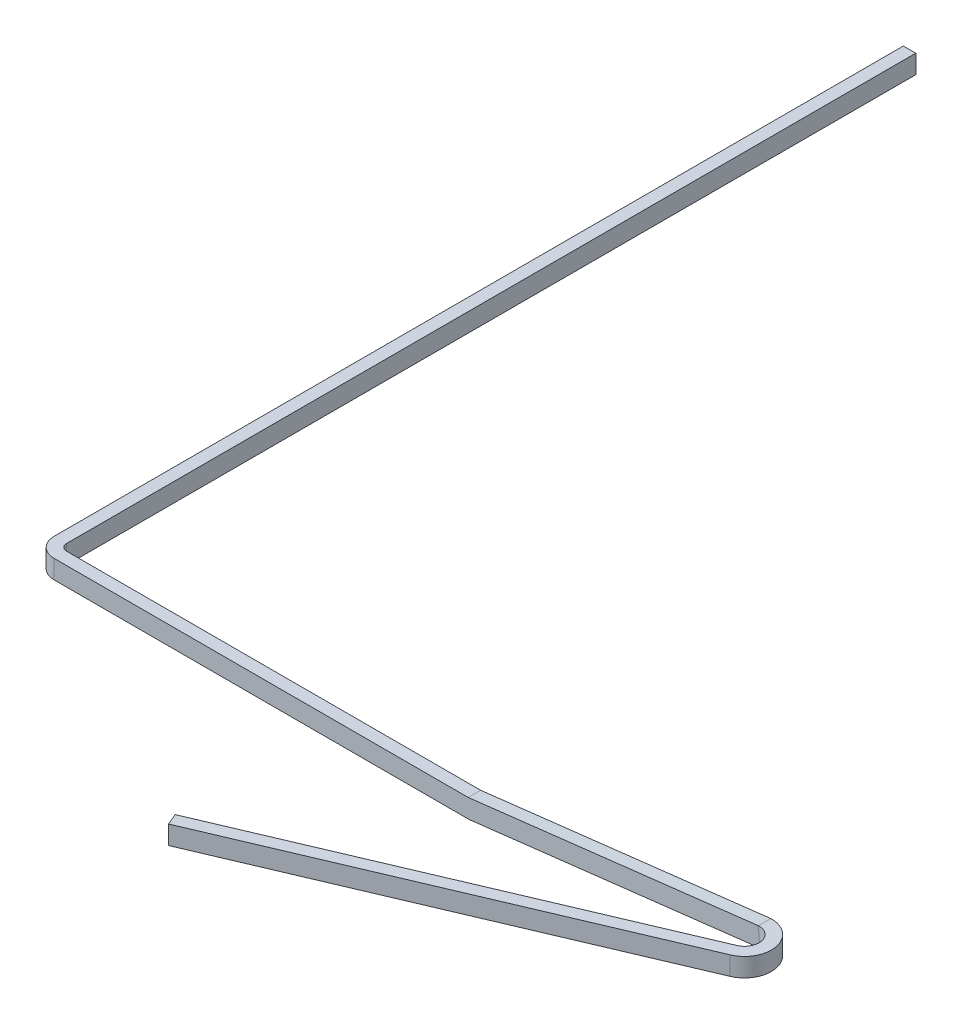
ISO-10303-21;
HEADER;
FILE_DESCRIPTION(('STEP AP214'),'2;1');
FILE_NAME('part.step','',(''),(''),'','','');
FILE_SCHEMA(('AUTOMOTIVE_DESIGN { 1 0 10303 214 1 1 1 1 }'));
ENDSEC;
DATA;
#1=APPLICATION_CONTEXT('core data for automotive mechanical design processes');
#2=APPLICATION_PROTOCOL_DEFINITION('international standard','automotive_design',2000,#1);
#3=PRODUCT_CONTEXT('',#1,'mechanical');
#4=PRODUCT('Part','Part','',(#3));
#5=PRODUCT_RELATED_PRODUCT_CATEGORY('part','',(#4));
#6=PRODUCT_DEFINITION_FORMATION('','',#4);
#7=PRODUCT_DEFINITION_CONTEXT('part definition',#1,'design');
#8=PRODUCT_DEFINITION('design','',#6,#7);
#9=PRODUCT_DEFINITION_SHAPE('','',#8);
#10=(LENGTH_UNIT() NAMED_UNIT(*) SI_UNIT(.MILLI.,.METRE.));
#11=(NAMED_UNIT(*) PLANE_ANGLE_UNIT() SI_UNIT($,.RADIAN.));
#12=(NAMED_UNIT(*) SI_UNIT($,.STERADIAN.) SOLID_ANGLE_UNIT());
#13=UNCERTAINTY_MEASURE_WITH_UNIT(LENGTH_MEASURE(1.E-05),#10,'distance_accuracy_value','');
#14=(GEOMETRIC_REPRESENTATION_CONTEXT(3) GLOBAL_UNCERTAINTY_ASSIGNED_CONTEXT((#13)) GLOBAL_UNIT_ASSIGNED_CONTEXT((#10,
#11,#12)) REPRESENTATION_CONTEXT('',''));
#15=CARTESIAN_POINT('',(0.,0.,0.));
#16=DIRECTION('',(0.,0.,1.));
#17=DIRECTION('',(1.,0.,0.));
#18=AXIS2_PLACEMENT_3D('',#15,#16,#17);
#19=CARTESIAN_POINT('',(0.31,-0.225,20.64));
#20=DIRECTION('',(0.,0.,-1.));
#21=DIRECTION('',(0.,1.,0.));
#22=AXIS2_PLACEMENT_3D('',#19,#20,#21);
#23=PLANE('',#22);
#24=DIRECTION('',(1.,0.,0.));
#25=VECTOR('',#24,1.);
#26=CARTESIAN_POINT('',(5.08656683421238,-0.225,20.64));
#27=LINE('',#26,#25);
#28=CARTESIAN_POINT('',(0.31,-0.225,20.64));
#29=VERTEX_POINT('',#28);
#30=CARTESIAN_POINT('',(10.3231336684248,-0.225,20.64));
#31=VERTEX_POINT('',#30);
#32=EDGE_CURVE('E324',#29,#31,#27,.T.);
#33=ORIENTED_EDGE('',*,*,#32,.F.);
#34=DIRECTION('',(0.,-1.,0.));
#35=VECTOR('',#34,1.);
#36=CARTESIAN_POINT('',(0.31,0.,20.64));
#37=LINE('',#36,#35);
#38=CARTESIAN_POINT('',(0.31,0.225,20.64));
#39=VERTEX_POINT('',#38);
#40=EDGE_CURVE('E345',#39,#29,#37,.T.);
#41=ORIENTED_EDGE('',*,*,#40,.F.);
#42=DIRECTION('',(-1.,0.,0.));
#43=VECTOR('',#42,1.);
#44=CARTESIAN_POINT('',(5.07343316578761,0.225,20.64));
#45=LINE('',#44,#43);
#46=CARTESIAN_POINT('',(10.2968663315752,0.225,20.64));
#47=VERTEX_POINT('',#46);
#48=EDGE_CURVE('E292',#47,#39,#45,.T.);
#49=ORIENTED_EDGE('',*,*,#48,.F.);
#50=DIRECTION('',(-0.993208592185619,-0.116347292227458,0.));
#51=VECTOR('',#50,1.);
#52=CARTESIAN_POINT('',(13.7968663315752,0.635,20.64));
#53=LINE('',#52,#51);
#54=CARTESIAN_POINT('',(17.2968663314596,1.045,20.6399993323574));
#55=VERTEX_POINT('',#54);
#56=EDGE_CURVE('E134',#55,#47,#53,.T.);
#57=ORIENTED_EDGE('',*,*,#56,.F.);
#58=CARTESIAN_POINT('',(17.3231302215046,0.595,20.6401555354667));
#59=CARTESIAN_POINT('',(17.3218906859797,0.616254266301594,20.6401279535253));
#60=CARTESIAN_POINT('',(17.3206445193682,0.637508148377784,20.640103762933));
#61=CARTESIAN_POINT('',(17.3181856588606,0.67930049269986,20.640063169754));
#62=CARTESIAN_POINT('',(17.3169732490465,0.69983897142249,20.6400465325687));
#63=CARTESIAN_POINT('',(17.3145869060956,0.740200570526522,20.6400206222529));
#64=CARTESIAN_POINT('',(17.3134131031457,0.760023698482069,20.6400111128803));
#65=CARTESIAN_POINT('',(17.3111027400392,0.798954202370559,20.6400009708636));
#66=CARTESIAN_POINT('',(17.3099663647422,0.818061589085829,20.6400000302292));
#67=CARTESIAN_POINT('',(17.3077632376295,0.855561436145326,20.6399987781224));
#68=CARTESIAN_POINT('',(17.3066954729521,0.873953836869247,20.6399984443796));
#69=CARTESIAN_POINT('',(17.3046164749485,0.910023265415586,20.639997928376));
#70=CARTESIAN_POINT('',(17.3036046594105,0.927700259886675,20.6399977407225));
#71=CARTESIAN_POINT('',(17.3016248866671,0.962338868445252,20.6399975671191));
#72=CARTESIAN_POINT('',(17.3006568120302,0.979300475782854,20.6399975733119));
#73=CARTESIAN_POINT('',(17.2987511882169,1.01250824245523,20.639997710638));
#74=CARTESIAN_POINT('',(17.2978140720708,1.02875442669067,20.6399978364946));
#75=CARTESIAN_POINT('',(17.2968663312287,1.045,20.6399979970723));
#76=B_SPLINE_CURVE_WITH_KNOTS('',3,(#58,#59,#60,#61,#62,#63,#64,#65,#66,#67,#68,#69,#70,#71,#72,
#73,#74,#75),.UNSPECIFIED.,.F.,.F.,(4,2,2,2,2,2,2,2,4),(0.,0.0638711900925387,0.125593905391981,
0.185167462832286,0.24259090062899,0.2978609917616,0.35097877761097,0.40194640838255,
0.450765977594925),.UNSPECIFIED.);
#77=CARTESIAN_POINT('',(17.3231330532769,0.595,20.640072721101));
#78=VERTEX_POINT('',#77);
#79=EDGE_CURVE('E122',#55,#78,#76,.F.);
#80=ORIENTED_EDGE('',*,*,#79,.T.);
#81=DIRECTION('',(0.993208592185619,0.116347292227457,0.));
#82=VECTOR('',#81,1.);
#83=CARTESIAN_POINT('',(13.8231336684248,0.185,20.64));
#84=LINE('',#83,#82);
#85=EDGE_CURVE('E148',#31,#78,#84,.T.);
#86=ORIENTED_EDGE('',*,*,#85,.F.);
#87=EDGE_LOOP('',(#33,#41,#49,#57,#80,#86));
#88=FACE_BOUND('',#87,.T.);
#89=ADVANCED_FACE('F15',(#88),#23,.T.);
#90=CARTESIAN_POINT('',(0.31,-0.27,20.48));
#91=DIRECTION('',(0.,1.,0.));
#92=DIRECTION('',(0.,0.,1.));
#93=AXIS2_PLACEMENT_3D('',#90,#91,#92);
#94=CYLINDRICAL_SURFACE('',#93,0.160000000000002);
#95=DIRECTION('',(0.,-1.,0.));
#96=VECTOR('',#95,1.);
#97=CARTESIAN_POINT('',(0.15,0.,20.48));
#98=LINE('',#97,#96);
#99=CARTESIAN_POINT('',(0.150000000000024,0.225,20.48));
#100=VERTEX_POINT('',#99);
#101=CARTESIAN_POINT('',(0.150000000000003,-0.225,20.48));
#102=VERTEX_POINT('',#101);
#103=EDGE_CURVE('E101',#100,#102,#98,.T.);
#104=ORIENTED_EDGE('',*,*,#103,.F.);
#105=CARTESIAN_POINT('',(0.31,0.225,20.48));
#106=DIRECTION('',(0.,1.,0.));
#107=DIRECTION('',(0.,0.,1.));
#108=AXIS2_PLACEMENT_3D('',#105,#106,#107);
#109=CIRCLE('',#108,0.160000000000002);
#110=EDGE_CURVE('E289',#39,#100,#109,.F.);
#111=ORIENTED_EDGE('',*,*,#110,.F.);
#112=ORIENTED_EDGE('',*,*,#40,.T.);
#113=CARTESIAN_POINT('',(0.31,-0.225,20.48));
#114=DIRECTION('',(0.,1.,0.));
#115=DIRECTION('',(0.,0.,1.));
#116=AXIS2_PLACEMENT_3D('',#113,#114,#115);
#117=CIRCLE('',#116,0.160000000000002);
#118=EDGE_CURVE('E317',#102,#29,#117,.T.);
#119=ORIENTED_EDGE('',*,*,#118,.F.);
#120=EDGE_LOOP('',(#104,#111,#112,#119));
#121=FACE_BOUND('',#120,.T.);
#122=ADVANCED_FACE('F390',(#121),#94,.F.);
#123=CARTESIAN_POINT('',(0.15,-0.225,0.));
#124=DIRECTION('',(1.,0.,0.));
#125=DIRECTION('',(0.,1.,0.));
#126=AXIS2_PLACEMENT_3D('',#123,#124,#125);
#127=PLANE('',#126);
#128=DIRECTION('',(0.,-1.,0.));
#129=VECTOR('',#128,1.);
#130=CARTESIAN_POINT('',(0.15,0.,0.));
#131=LINE('',#130,#129);
#132=CARTESIAN_POINT('',(0.150000000000032,0.225,0.));
#133=VERTEX_POINT('',#132);
#134=CARTESIAN_POINT('',(0.150000000000003,-0.225,0.));
#135=VERTEX_POINT('',#134);
#136=EDGE_CURVE('E113',#133,#135,#131,.T.);
#137=ORIENTED_EDGE('',*,*,#136,.F.);
#138=DIRECTION('',(0.,0.,-1.));
#139=VECTOR('',#138,1.);
#140=CARTESIAN_POINT('',(0.150000000000049,0.225,10.47));
#141=LINE('',#140,#139);
#142=EDGE_CURVE('E286',#100,#133,#141,.T.);
#143=ORIENTED_EDGE('',*,*,#142,.F.);
#144=ORIENTED_EDGE('',*,*,#103,.T.);
#145=DIRECTION('',(0.,0.,1.));
#146=VECTOR('',#145,1.);
#147=CARTESIAN_POINT('',(0.150000000000006,-0.225,10.47));
#148=LINE('',#147,#146);
#149=EDGE_CURVE('E314',#135,#102,#148,.T.);
#150=ORIENTED_EDGE('',*,*,#149,.F.);
#151=EDGE_LOOP('',(#137,#143,#144,#150));
#152=FACE_BOUND('',#151,.T.);
#153=ADVANCED_FACE('F388',(#152),#127,.T.);
#154=CARTESIAN_POINT('',(0.15,-0.225,0.));
#155=DIRECTION('',(0.,0.,-1.));
#156=DIRECTION('',(-1.,0.,0.));
#157=AXIS2_PLACEMENT_3D('',#154,#155,#156);
#158=PLANE('',#157);
#159=DIRECTION('',(0.,-1.,0.));
#160=VECTOR('',#159,1.);
#161=CARTESIAN_POINT('',(-0.15,0.,0.));
#162=LINE('',#161,#160);
#163=CARTESIAN_POINT('',(-0.15,0.225,0.));
#164=VERTEX_POINT('',#163);
#165=CARTESIAN_POINT('',(-0.15,-0.225,0.));
#166=VERTEX_POINT('',#165);
#167=EDGE_CURVE('E329',#164,#166,#162,.T.);
#168=ORIENTED_EDGE('',*,*,#167,.F.);
#169=DIRECTION('',(-1.,0.,0.));
#170=VECTOR('',#169,1.);
#171=CARTESIAN_POINT('',(5.07343316578761,0.225,0.));
#172=LINE('',#171,#170);
#173=EDGE_CURVE('E283',#133,#164,#172,.T.);
#174=ORIENTED_EDGE('',*,*,#173,.F.);
#175=ORIENTED_EDGE('',*,*,#136,.T.);
#176=DIRECTION('',(1.,0.,0.));
#177=VECTOR('',#176,1.);
#178=CARTESIAN_POINT('',(5.08656683421238,-0.225,0.));
#179=LINE('',#178,#177);
#180=EDGE_CURVE('E318',#166,#135,#179,.T.);
#181=ORIENTED_EDGE('',*,*,#180,.F.);
#182=EDGE_LOOP('',(#168,#174,#175,#181));
#183=FACE_BOUND('',#182,.T.);
#184=ADVANCED_FACE('F379',(#183),#158,.T.);
#185=CARTESIAN_POINT('',(-0.15,0.225,0.));
#186=DIRECTION('',(-1.,0.,0.));
#187=DIRECTION('',(0.,-1.,0.));
#188=AXIS2_PLACEMENT_3D('',#185,#186,#187);
#189=PLANE('',#188);
#190=DIRECTION('',(0.,0.,1.));
#191=VECTOR('',#190,1.);
#192=CARTESIAN_POINT('',(-0.15,0.225,10.47));
#193=LINE('',#192,#191);
#194=CARTESIAN_POINT('',(-0.15,0.225,20.48));
#195=VERTEX_POINT('',#194);
#196=EDGE_CURVE('E279',#164,#195,#193,.T.);
#197=ORIENTED_EDGE('',*,*,#196,.F.);
#198=ORIENTED_EDGE('',*,*,#167,.T.);
#199=DIRECTION('',(0.,0.,-1.));
#200=VECTOR('',#199,1.);
#201=CARTESIAN_POINT('',(-0.15,-0.225,10.47));
#202=LINE('',#201,#200);
#203=CARTESIAN_POINT('',(-0.15,-0.225,20.48));
#204=VERTEX_POINT('',#203);
#205=EDGE_CURVE('E321',#204,#166,#202,.T.);
#206=ORIENTED_EDGE('',*,*,#205,.F.);
#207=DIRECTION('',(0.,1.,0.));
#208=VECTOR('',#207,1.);
#209=CARTESIAN_POINT('',(-0.15,0.,20.48));
#210=LINE('',#209,#208);
#211=EDGE_CURVE('E332',#204,#195,#210,.T.);
#212=ORIENTED_EDGE('',*,*,#211,.T.);
#213=EDGE_LOOP('',(#197,#198,#206,#212));
#214=FACE_BOUND('',#213,.T.);
#215=ADVANCED_FACE('F382',(#214),#189,.T.);
#216=CARTESIAN_POINT('',(-0.15,-0.225,20.94));
#217=DIRECTION('',(0.,-1.,0.));
#218=DIRECTION('',(0.,0.,-1.));
#219=AXIS2_PLACEMENT_3D('',#216,#217,#218);
#220=PLANE('',#219);
#221=ORIENTED_EDGE('',*,*,#149,.T.);
#222=ORIENTED_EDGE('',*,*,#118,.T.);
#223=ORIENTED_EDGE('',*,*,#32,.T.);
#224=DIRECTION('',(0.,0.,-1.));
#225=VECTOR('',#224,1.);
#226=CARTESIAN_POINT('',(10.3231336684248,-0.225,20.79));
#227=LINE('',#226,#225);
#228=CARTESIAN_POINT('',(10.3231336684248,-0.225000000000002,20.94));
#229=VERTEX_POINT('',#228);
#230=EDGE_CURVE('E153',#229,#31,#227,.T.);
#231=ORIENTED_EDGE('',*,*,#230,.F.);
#232=DIRECTION('',(1.,0.,0.));
#233=VECTOR('',#232,1.);
#234=CARTESIAN_POINT('',(8.86760623521767,-0.225,20.94));
#235=LINE('',#234,#233);
#236=CARTESIAN_POINT('',(0.310000000000003,-0.225,20.94));
#237=VERTEX_POINT('',#236);
#238=EDGE_CURVE('E165',#237,#229,#235,.T.);
#239=ORIENTED_EDGE('',*,*,#238,.F.);
#240=CARTESIAN_POINT('',(0.310000000000006,-0.225,20.48));
#241=DIRECTION('',(0.,1.,0.));
#242=DIRECTION('',(0.,0.,1.));
#243=AXIS2_PLACEMENT_3D('',#240,#241,#242);
#244=CIRCLE('',#243,0.460000000000002);
#245=EDGE_CURVE('E282',#204,#237,#244,.T.);
#246=ORIENTED_EDGE('',*,*,#245,.F.);
#247=ORIENTED_EDGE('',*,*,#205,.T.);
#248=ORIENTED_EDGE('',*,*,#180,.T.);
#249=EDGE_LOOP('',(#221,#222,#223,#231,#239,#246,#247,#248));
#250=FACE_BOUND('',#249,.T.);
#251=ADVANCED_FACE('F374',(#250),#220,.T.);
#252=CARTESIAN_POINT('',(10.3231336684248,-0.225,20.64));
#253=DIRECTION('',(0.116347292227457,-0.993208592185619,0.));
#254=DIRECTION('',(0.993208592185619,0.116347292227457,0.));
#255=AXIS2_PLACEMENT_3D('',#252,#253,#254);
#256=PLANE('',#255);
#257=DIRECTION('',(0.993208592185619,0.116347292227459,0.));
#258=VECTOR('',#257,1.);
#259=CARTESIAN_POINT('',(10.3231336684248,-0.225,20.94));
#260=LINE('',#259,#258);
#261=CARTESIAN_POINT('',(17.3231326995068,0.595000000000001,20.9401142343716));
#262=VERTEX_POINT('',#261);
#263=EDGE_CURVE('E146',#229,#262,#260,.T.);
#264=ORIENTED_EDGE('',*,*,#263,.F.);
#265=ORIENTED_EDGE('',*,*,#230,.T.);
#266=ORIENTED_EDGE('',*,*,#85,.T.);
#267=DIRECTION('',(0.,0.,1.));
#268=VECTOR('',#267,1.);
#269=CARTESIAN_POINT('',(17.3231336684248,0.594999999999998,20.64));
#270=LINE('',#269,#268);
#271=EDGE_CURVE('E142',#78,#262,#270,.T.);
#272=ORIENTED_EDGE('',*,*,#271,.T.);
#273=EDGE_LOOP('',(#264,#265,#266,#272));
#274=FACE_BOUND('',#273,.T.);
#275=ADVANCED_FACE('F144',(#274),#256,.T.);
#276=CARTESIAN_POINT('',(17.2968663315753,1.045,20.64));
#277=DIRECTION('',(-0.116347292227458,0.993208592185619,0.));
#278=DIRECTION('',(-0.993208592185619,-0.116347292227458,0.));
#279=AXIS2_PLACEMENT_3D('',#276,#277,#278);
#280=PLANE('',#279);
#281=ORIENTED_EDGE('',*,*,#56,.T.);
#282=DIRECTION('',(0.,0.,-1.));
#283=VECTOR('',#282,1.);
#284=CARTESIAN_POINT('',(10.2968663315752,0.225,10.47));
#285=LINE('',#284,#283);
#286=CARTESIAN_POINT('',(10.2968663315753,0.225000000000001,20.94));
#287=VERTEX_POINT('',#286);
#288=EDGE_CURVE('E295',#287,#47,#285,.T.);
#289=ORIENTED_EDGE('',*,*,#288,.F.);
#290=DIRECTION('',(-0.993208592185619,-0.116347292227459,0.));
#291=VECTOR('',#290,1.);
#292=CARTESIAN_POINT('',(17.2968663315752,1.045,20.94));
#293=LINE('',#292,#291);
#294=CARTESIAN_POINT('',(17.2968663315547,1.04499999980323,20.9399996687333));
#295=VERTEX_POINT('',#294);
#296=EDGE_CURVE('E166',#295,#287,#293,.T.);
#297=ORIENTED_EDGE('',*,*,#296,.F.);
#298=DIRECTION('',(0.,0.,-1.));
#299=VECTOR('',#298,1.);
#300=CARTESIAN_POINT('',(17.2968663315753,1.045,20.79));
#301=LINE('',#300,#299);
#302=EDGE_CURVE('E305',#295,#55,#301,.T.);
#303=ORIENTED_EDGE('',*,*,#302,.T.);
#304=EDGE_LOOP('',(#281,#289,#297,#303));
#305=FACE_BOUND('',#304,.T.);
#306=ADVANCED_FACE('F406',(#305),#280,.T.);
#307=CARTESIAN_POINT('',(-0.15,0.225,0.));
#308=DIRECTION('',(0.,1.,0.));
#309=DIRECTION('',(0.,0.,1.));
#310=AXIS2_PLACEMENT_3D('',#307,#308,#309);
#311=PLANE('',#310);
#312=ORIENTED_EDGE('',*,*,#196,.T.);
#313=CARTESIAN_POINT('',(0.310000000000006,0.225,20.48));
#314=DIRECTION('',(0.,1.,0.));
#315=DIRECTION('',(0.,0.,1.));
#316=AXIS2_PLACEMENT_3D('',#313,#314,#315);
#317=CIRCLE('',#316,0.460000000000002);
#318=CARTESIAN_POINT('',(0.310000000000003,0.224999999999999,20.94));
#319=VERTEX_POINT('',#318);
#320=EDGE_CURVE('E313',#319,#195,#317,.F.);
#321=ORIENTED_EDGE('',*,*,#320,.F.);
#322=DIRECTION('',(-1.,0.,0.));
#323=VECTOR('',#322,1.);
#324=CARTESIAN_POINT('',(8.86760623521767,0.224999999999998,20.94));
#325=LINE('',#324,#323);
#326=EDGE_CURVE('E299',#287,#319,#325,.T.);
#327=ORIENTED_EDGE('',*,*,#326,.F.);
#328=ORIENTED_EDGE('',*,*,#288,.T.);
#329=ORIENTED_EDGE('',*,*,#48,.T.);
#330=ORIENTED_EDGE('',*,*,#110,.T.);
#331=ORIENTED_EDGE('',*,*,#142,.T.);
#332=ORIENTED_EDGE('',*,*,#173,.T.);
#333=EDGE_LOOP('',(#312,#321,#327,#328,#329,#330,#331,#332));
#334=FACE_BOUND('',#333,.T.);
#335=ADVANCED_FACE('F385',(#334),#311,.T.);
#336=CARTESIAN_POINT('',(0.310000000000006,-0.27,20.48));
#337=DIRECTION('',(0.,1.,0.));
#338=DIRECTION('',(0.,0.,1.));
#339=AXIS2_PLACEMENT_3D('',#336,#337,#338);
#340=CYLINDRICAL_SURFACE('',#339,0.460000000000002);
#341=ORIENTED_EDGE('',*,*,#320,.T.);
#342=ORIENTED_EDGE('',*,*,#211,.F.);
#343=ORIENTED_EDGE('',*,*,#245,.T.);
#344=DIRECTION('',(0.,-1.,0.));
#345=VECTOR('',#344,1.);
#346=CARTESIAN_POINT('',(0.31,0.41381,20.94));
#347=LINE('',#346,#345);
#348=EDGE_CURVE('E276',#319,#237,#347,.T.);
#349=ORIENTED_EDGE('',*,*,#348,.F.);
#350=EDGE_LOOP('',(#341,#342,#343,#349));
#351=FACE_BOUND('',#350,.T.);
#352=ADVANCED_FACE('F410',(#351),#340,.T.);
#353=CARTESIAN_POINT('',(0.31,1.05262,20.94));
#354=DIRECTION('',(0.,0.,1.));
#355=DIRECTION('',(0.,-1.,0.));
#356=AXIS2_PLACEMENT_3D('',#353,#354,#355);
#357=PLANE('',#356);
#358=ORIENTED_EDGE('',*,*,#326,.T.);
#359=ORIENTED_EDGE('',*,*,#348,.T.);
#360=ORIENTED_EDGE('',*,*,#238,.T.);
#361=ORIENTED_EDGE('',*,*,#263,.T.);
#362=CARTESIAN_POINT('',(17.2968663314791,1.045,20.9399990061999));
#363=CARTESIAN_POINT('',(17.2980874467142,1.02407492336358,20.9399990022844));
#364=CARTESIAN_POINT('',(17.2993310525555,1.00315119620513,20.9399988439639));
#365=CARTESIAN_POINT('',(17.3018018608331,0.961924891482683,20.9399986355997));
#366=CARTESIAN_POINT('',(17.3030284576086,0.941622277741554,20.9399985824869));
#367=CARTESIAN_POINT('',(17.3054415379848,0.901638416904871,20.9399989478271));
#368=CARTESIAN_POINT('',(17.3066281000462,0.881957174830676,20.9399993518937));
#369=CARTESIAN_POINT('',(17.3089151678009,0.843214968935537,20.9399992260105));
#370=CARTESIAN_POINT('',(17.3100172087025,0.824154095908414,20.9399987252285));
#371=CARTESIAN_POINT('',(17.3121696736503,0.7866536492202,20.9400044937382));
#372=CARTESIAN_POINT('',(17.3132206083524,0.768214104367214,20.9400105425759));
#373=CARTESIAN_POINT('',(17.3152841360793,0.731956206557085,20.9400303247312));
#374=CARTESIAN_POINT('',(17.3162968277818,0.714137859140669,20.940043792237));
#375=CARTESIAN_POINT('',(17.3182891723964,0.679122255501243,20.9400787606884));
#376=CARTESIAN_POINT('',(17.3192687468026,0.661924994553612,20.940099965319));
#377=CARTESIAN_POINT('',(17.3212044539856,0.628151642348549,20.9401509868563));
#378=CARTESIAN_POINT('',(17.3221601573729,0.611575525926491,20.9401804654316));
#379=CARTESIAN_POINT('',(17.3231259622333,0.595,20.9402150471237));
#380=B_SPLINE_CURVE_WITH_KNOTS('',3,(#362,#363,#364,#365,#366,#367,#368,#369,#370,#371,#372,
#373,#374,#375,#376,#377,#378,#379),.UNSPECIFIED.,.F.,.F.,(4,2,2,2,2,2,2,2,4),(0.,
0.062881965494419,0.123900863028297,0.183051768746084,0.240329843385691,0.295738256427578,
0.349279575236822,0.400955020514216,0.450766030623628),.UNSPECIFIED.);
#381=EDGE_CURVE('E161',#295,#262,#380,.T.);
#382=ORIENTED_EDGE('',*,*,#381,.F.);
#383=ORIENTED_EDGE('',*,*,#296,.T.);
#384=EDGE_LOOP('',(#358,#359,#360,#361,#382,#383));
#385=FACE_BOUND('',#384,.T.);
#386=ADVANCED_FACE('F159',(#385),#357,.T.);
#387=CARTESIAN_POINT('',(7.88120866507169,1.045,20.64));
#388=DIRECTION('',(0.,1.,0.));
#389=DIRECTION('',(0.,0.,1.));
#390=AXIS2_PLACEMENT_3D('',#387,#388,#389);
#391=PLANE('',#390);
#392=DIRECTION('',(1.,0.,0.));
#393=VECTOR('',#392,1.);
#394=CARTESIAN_POINT('',(7.88120866507169,1.045,20.9399990061999));
#395=LINE('',#394,#393);
#396=CARTESIAN_POINT('',(17.31,1.045,20.94));
#397=VERTEX_POINT('',#396);
#398=EDGE_CURVE('E176',#397,#295,#395,.F.);
#399=ORIENTED_EDGE('',*,*,#398,.F.);
#400=CARTESIAN_POINT('',(17.4468982813718,1.045,21.6121162221271));
#401=CARTESIAN_POINT('',(17.4832168228053,1.045,21.5967167026277));
#402=CARTESIAN_POINT('',(17.5167935222807,1.045,21.5749093463834));
#403=CARTESIAN_POINT('',(17.5750871937298,1.045,21.5216299486729));
#404=CARTESIAN_POINT('',(17.5998090794989,1.045,21.4901632854996));
#405=CARTESIAN_POINT('',(17.6370496477915,1.045,21.4207206403003));
#406=CARTESIAN_POINT('',(17.6495783151177,1.045,21.3827500142684));
#407=CARTESIAN_POINT('',(17.6616835784681,1.045,21.3049572144608));
#408=CARTESIAN_POINT('',(17.661310742984,1.045,21.2651428803669));
#409=CARTESIAN_POINT('',(17.647050199088,1.045,21.1877618490349));
#410=CARTESIAN_POINT('',(17.6330864788598,1.045,21.150209054994));
#411=CARTESIAN_POINT('',(17.5939141892114,1.045,21.0819440356128));
#412=CARTESIAN_POINT('',(17.5687884775294,1.045,21.0511838609029));
#413=CARTESIAN_POINT('',(17.5093423644813,1.045,20.9995690520425));
#414=CARTESIAN_POINT('',(17.4749443224729,1.045,20.9788023863391));
#415=CARTESIAN_POINT('',(17.417854531417,1.045,20.9563095378119));
#416=CARTESIAN_POINT('',(17.3967640847149,1.045,20.9502226907249));
#417=CARTESIAN_POINT('',(17.3537994275225,1.045,20.9420615933635));
#418=CARTESIAN_POINT('',(17.3319244702857,1.045,20.93999127539));
#419=CARTESIAN_POINT('',(17.3099999999991,1.045,20.94));
#420=B_SPLINE_CURVE_WITH_KNOTS('',3,(#400,#401,#402,#403,#404,#405,#406,#407,#408,#409,#410,
#411,#412,#413,#414,#415,#416,#417,#418,#419),.UNSPECIFIED.,.F.,.F.,(4,2,2,2,2,2,2,2,2,4),(0.,
0.117848498601387,0.235631497928443,0.353317965560692,0.470543203933827,0.588427855554702,
0.705451679315463,0.823487579408933,0.889004181516128,0.954584894010068),.UNSPECIFIED.);
#421=CARTESIAN_POINT('',(17.4468982813718,1.045,21.6121162221271));
#422=VERTEX_POINT('',#421);
#423=EDGE_CURVE('E225',#422,#397,#420,.T.);
#424=ORIENTED_EDGE('',*,*,#423,.F.);
#425=DIRECTION('',(0.920332063220277,0.,-0.391137946776719));
#426=VECTOR('',#425,1.);
#427=CARTESIAN_POINT('',(12.6941137946777,1.045,23.632033206322));
#428=LINE('',#427,#426);
#429=CARTESIAN_POINT('',(7.94132930798349,1.045,25.651950190517));
#430=VERTEX_POINT('',#429);
#431=EDGE_CURVE('E178',#430,#422,#428,.T.);
#432=ORIENTED_EDGE('',*,*,#431,.F.);
#433=DIRECTION('',(0.391137946776794,0.,0.920332063220245));
#434=VECTOR('',#433,1.);
#435=CARTESIAN_POINT('',(7.94132930798349,1.045,25.651950190517));
#436=LINE('',#435,#434);
#437=CARTESIAN_POINT('',(8.05867069201651,1.045,25.928049809483));
#438=VERTEX_POINT('',#437);
#439=EDGE_CURVE('E233',#430,#438,#436,.T.);
#440=ORIENTED_EDGE('',*,*,#439,.T.);
#441=DIRECTION('',(-0.920332063220278,0.,0.391137946776717));
#442=VECTOR('',#441,1.);
#443=CARTESIAN_POINT('',(12.8114551787107,1.045,23.9081328252881));
#444=LINE('',#443,#442);
#445=CARTESIAN_POINT('',(17.5642396654049,1.045,21.8882158410932));
#446=VERTEX_POINT('',#445);
#447=EDGE_CURVE('E273',#446,#438,#444,.T.);
#448=ORIENTED_EDGE('',*,*,#447,.F.);
#449=CARTESIAN_POINT('',(17.2968663312278,1.045,20.6399979970722));
#450=CARTESIAN_POINT('',(17.2990547331298,1.045,20.6400036254727));
#451=CARTESIAN_POINT('',(17.3012430101725,1.045,20.6400004746689));
#452=CARTESIAN_POINT('',(17.3056208165109,1.045,20.6399950056978));
#453=CARTESIAN_POINT('',(17.3078103458065,1.045,20.639992688008));
#454=CARTESIAN_POINT('',(17.3291155912186,1.045,20.6400638333901));
#455=CARTESIAN_POINT('',(17.3482407011999,1.045,20.6408615658551));
#456=CARTESIAN_POINT('',(17.3863480326751,1.045,20.6441984957184));
#457=CARTESIAN_POINT('',(17.4053301637556,1.045,20.6467387145341));
#458=CARTESIAN_POINT('',(17.4430294198139,1.045,20.6534754548256));
#459=CARTESIAN_POINT('',(17.4617460754566,1.045,20.6576746033339));
#460=CARTESIAN_POINT('',(17.4987300452,1.045,20.6677065662866));
#461=CARTESIAN_POINT('',(17.5169974079532,1.045,20.6735392029908));
#462=CARTESIAN_POINT('',(17.5693002084941,1.045,20.6928465145717));
#463=CARTESIAN_POINT('',(17.6025756155455,1.045,20.7084485349521));
#464=CARTESIAN_POINT('',(17.6660378461134,1.045,20.74496384491));
#465=CARTESIAN_POINT('',(17.6962258916603,1.045,20.7658750215295));
#466=CARTESIAN_POINT('',(17.7525205695901,1.045,20.812537774078));
#467=CARTESIAN_POINT('',(17.7786339785986,1.045,20.8382811528803));
#468=CARTESIAN_POINT('',(17.8261928606781,1.045,20.8937730604876));
#469=CARTESIAN_POINT('',(17.8476359900206,1.045,20.9235235881718));
#470=CARTESIAN_POINT('',(17.8853396115391,1.045,20.9861320980525));
#471=CARTESIAN_POINT('',(17.9016025611724,1.045,21.0189885971658));
#472=CARTESIAN_POINT('',(17.9284361104224,1.045,21.0869608189003));
#473=CARTESIAN_POINT('',(17.9390029478144,1.045,21.1220780175945));
#474=CARTESIAN_POINT('',(17.9612533833922,1.045,21.2293251224664));
#475=CARTESIAN_POINT('',(17.9636127144963,1.045,21.3035586419863));
#476=CARTESIAN_POINT('',(17.9441918676678,1.045,21.4485986906032));
#477=CARTESIAN_POINT('',(17.9224710246415,1.045,21.5194131965494));
#478=CARTESIAN_POINT('',(17.8729740764239,1.045,21.6169869312887));
#479=CARTESIAN_POINT('',(17.8535561936209,1.045,21.6481654992286));
#480=CARTESIAN_POINT('',(17.8097358770632,1.045,21.7068685562952));
#481=CARTESIAN_POINT('',(17.7853276881859,1.045,21.734388765361));
#482=CARTESIAN_POINT('',(17.7305486724224,1.045,21.7866955973751));
#483=CARTESIAN_POINT('',(17.6998907291176,1.045,21.8111821476119));
#484=CARTESIAN_POINT('',(17.6347235666422,1.045,21.8542979912195));
#485=CARTESIAN_POINT('',(17.6002157431932,1.045,21.8729293980034));
#486=CARTESIAN_POINT('',(17.5642396654048,1.045,21.8882158410932));
#487=B_SPLINE_CURVE_WITH_KNOTS('',3,(#449,#450,#451,#452,#453,#454,#455,#456,#457,#458,#459,
#460,#461,#462,#463,#464,#465,#466,#467,#468,#469,#470,#471,#472,#473,#474,#475,#476,#477,#478,
#479,#480,#481,#482,#483,#484,#485,#486),.UNSPECIFIED.,.F.,.F.,(4,2,2,2,2,2,2,2,2,2,2,2,2,2,2,2,
2,2,4),(0.,0.00656495590468881,0.0131336691659504,0.0704782662659054,0.12785650659829,
0.185325976001981,0.242789194565564,0.352483962255645,0.462135141457612,0.571601967434802,
0.681123602204585,0.790593202683597,0.900135018410406,1.11852786235045,1.33638376771871,
1.4460952679055,1.55593401504614,1.67301828864035,1.79006025201431),.UNSPECIFIED.);
#488=EDGE_CURVE('E129',#55,#446,#487,.T.);
#489=ORIENTED_EDGE('',*,*,#488,.F.);
#490=ORIENTED_EDGE('',*,*,#302,.F.);
#491=EDGE_LOOP('',(#399,#424,#432,#440,#448,#489,#490));
#492=FACE_BOUND('',#491,.T.);
#493=ADVANCED_FACE('F235',(#492),#391,.T.);
#494=CARTESIAN_POINT('',(8.0586706920165,0.595,25.928049809483));
#495=DIRECTION('',(0.391137946776717,0.,0.920332063220278));
#496=DIRECTION('',(0.920332063220278,0.,-0.391137946776717));
#497=AXIS2_PLACEMENT_3D('',#494,#495,#496);
#498=PLANE('',#497);
#499=DIRECTION('',(-0.920332063220278,0.,0.391137946776717));
#500=VECTOR('',#499,1.);
#501=CARTESIAN_POINT('',(17.5642396654048,0.595,21.8882158410932));
#502=LINE('',#501,#500);
#503=CARTESIAN_POINT('',(17.5642396654048,0.595,21.8882158410932));
#504=VERTEX_POINT('',#503);
#505=CARTESIAN_POINT('',(8.0586706920165,0.595,25.928049809483));
#506=VERTEX_POINT('',#505);
#507=EDGE_CURVE('E186',#504,#506,#502,.T.);
#508=ORIENTED_EDGE('',*,*,#507,.F.);
#509=DIRECTION('',(0.,-1.,0.));
#510=VECTOR('',#509,1.);
#511=CARTESIAN_POINT('',(17.5642396654048,0.82,21.8882158410932));
#512=LINE('',#511,#510);
#513=EDGE_CURVE('E267',#446,#504,#512,.T.);
#514=ORIENTED_EDGE('',*,*,#513,.F.);
#515=ORIENTED_EDGE('',*,*,#447,.T.);
#516=DIRECTION('',(0.,-1.,0.));
#517=VECTOR('',#516,1.);
#518=CARTESIAN_POINT('',(8.0586706920165,0.82,25.928049809483));
#519=LINE('',#518,#517);
#520=EDGE_CURVE('E271',#438,#506,#519,.T.);
#521=ORIENTED_EDGE('',*,*,#520,.T.);
#522=EDGE_LOOP('',(#508,#514,#515,#521));
#523=FACE_BOUND('',#522,.T.);
#524=ADVANCED_FACE('F240',(#523),#498,.T.);
#525=CARTESIAN_POINT('',(17.4468982813718,0.595,21.6121162221271));
#526=DIRECTION('',(-0.39113794677672,0.,-0.920332063220277));
#527=DIRECTION('',(-0.920332063220277,0.,0.39113794677672));
#528=AXIS2_PLACEMENT_3D('',#525,#526,#527);
#529=PLANE('',#528);
#530=ORIENTED_EDGE('',*,*,#431,.T.);
#531=DIRECTION('',(0.,1.,0.));
#532=VECTOR('',#531,1.);
#533=CARTESIAN_POINT('',(17.4468982813718,0.82,21.6121162221271));
#534=LINE('',#533,#532);
#535=CARTESIAN_POINT('',(17.4468982813718,0.595,21.6121162221271));
#536=VERTEX_POINT('',#535);
#537=EDGE_CURVE('E177',#536,#422,#534,.T.);
#538=ORIENTED_EDGE('',*,*,#537,.F.);
#539=DIRECTION('',(0.920332063220276,0.,-0.391137946776721));
#540=VECTOR('',#539,1.);
#541=CARTESIAN_POINT('',(7.94132930798348,0.595,25.651950190517));
#542=LINE('',#541,#540);
#543=CARTESIAN_POINT('',(7.94132930798349,0.595,25.651950190517));
#544=VERTEX_POINT('',#543);
#545=EDGE_CURVE('E183',#544,#536,#542,.T.);
#546=ORIENTED_EDGE('',*,*,#545,.F.);
#547=DIRECTION('',(0.,1.,0.));
#548=VECTOR('',#547,1.);
#549=CARTESIAN_POINT('',(7.94132930798349,0.82,25.651950190517));
#550=LINE('',#549,#548);
#551=EDGE_CURVE('E38',#544,#430,#550,.T.);
#552=ORIENTED_EDGE('',*,*,#551,.T.);
#553=EDGE_LOOP('',(#530,#538,#546,#552));
#554=FACE_BOUND('',#553,.T.);
#555=ADVANCED_FACE('F208',(#554),#529,.T.);
#556=CARTESIAN_POINT('',(17.2881776939879,1.045,20.9399998802778));
#557=CARTESIAN_POINT('',(17.2956911407136,1.045,20.9399993617632));
#558=CARTESIAN_POINT('',(17.3038025266674,1.045,20.9399974481798));
#559=CARTESIAN_POINT('',(17.3221487614917,1.045,20.9400050022732));
#560=CARTESIAN_POINT('',(17.3300015939791,1.045,20.9404291023397));
#561=CARTESIAN_POINT('',(17.349915868963,1.045,20.9421399708764));
#562=CARTESIAN_POINT('',(17.3598334632571,1.045,20.9434218193108));
#563=CARTESIAN_POINT('',(17.3893659714026,1.045,20.9485321680292));
#564=CARTESIAN_POINT('',(17.408760688396,1.045,20.9536290289917));
#565=CARTESIAN_POINT('',(17.4652104506489,1.045,20.9737625398497));
#566=CARTESIAN_POINT('',(17.5004741867122,1.045,20.9936625385646));
#567=CARTESIAN_POINT('',(17.593302370079,1.045,21.0694892431178));
#568=CARTESIAN_POINT('',(17.6370098672595,1.045,21.1418453600298));
#569=CARTESIAN_POINT('',(17.6689065675115,1.045,21.2984454974239));
#570=CARTESIAN_POINT('',(17.656982448521,1.045,21.3821326817595));
#571=CARTESIAN_POINT('',(17.5826169077395,1.045,21.5235921065534));
#572=CARTESIAN_POINT('',(17.5205491717275,1.045,21.5808148482173));
#573=CARTESIAN_POINT('',(17.4468982813718,1.045,21.6121162221271));
#574=CARTESIAN_POINT('',(17.2881776939879,0.595,20.9399998802778));
#575=CARTESIAN_POINT('',(17.2956911407136,0.595,20.9399993617632));
#576=CARTESIAN_POINT('',(17.3038025266674,0.595,20.9399974481798));
#577=CARTESIAN_POINT('',(17.3221487614917,0.595,20.9400050022732));
#578=CARTESIAN_POINT('',(17.3300015939791,0.595,20.9404291023397));
#579=CARTESIAN_POINT('',(17.349915868963,0.595,20.9421399708764));
#580=CARTESIAN_POINT('',(17.3598334632571,0.595,20.9434218193108));
#581=CARTESIAN_POINT('',(17.3893659714026,0.595,20.9485321680291));
#582=CARTESIAN_POINT('',(17.408760688396,0.595,20.9536290289917));
#583=CARTESIAN_POINT('',(17.4652104506489,0.595,20.9737625398497));
#584=CARTESIAN_POINT('',(17.5004741867122,0.595,20.9936625385646));
#585=CARTESIAN_POINT('',(17.593302370079,0.595,21.0694892431178));
#586=CARTESIAN_POINT('',(17.6370098672595,0.595,21.1418453600298));
#587=CARTESIAN_POINT('',(17.6689065675115,0.595,21.2984454974239));
#588=CARTESIAN_POINT('',(17.656982448521,0.595,21.3821326817595));
#589=CARTESIAN_POINT('',(17.5826169077395,0.595,21.5235921065534));
#590=CARTESIAN_POINT('',(17.5205491717275,0.595,21.5808148482173));
#591=CARTESIAN_POINT('',(17.4468982813718,0.595,21.6121162221271));
#592=B_SPLINE_SURFACE_WITH_KNOTS('',1,3,((#556,#557,#558,#559,#560,#561,#562,#563,#564,#565,
#566,#567,#568,#569,#570,#571,#572,#573),(#574,#575,#576,#577,#578,#579,#580,#581,#582,#583,
#584,#585,#586,#587,#588,#589,#590,#591)),.UNSPECIFIED.,.F.,.F.,.F.,(2,2),(4,2,2,2,2,2,2,2,4),
(0.,1.),(-0.00186675718776,0.,0.00365936029408,0.00731872058815,0.0146374411763,
0.02927488235261,0.05854976470521,0.08782464705782,0.11709952941042),.UNSPECIFIED.);
#593=CARTESIAN_POINT('',(17.4468982813718,0.595,21.6121162221271));
#594=CARTESIAN_POINT('',(17.4832168082142,0.595,21.5967166963285));
#595=CARTESIAN_POINT('',(17.5167935149871,0.595,21.5749093432347));
#596=CARTESIAN_POINT('',(17.5750872010193,0.595,21.5216299518199));
#597=CARTESIAN_POINT('',(17.5998090940739,0.595,21.4901632917918));
#598=CARTESIAN_POINT('',(17.6370496332285,0.595,21.4207206340133));
#599=CARTESIAN_POINT('',(17.6495782641672,0.595,21.3827499922724));
#600=CARTESIAN_POINT('',(17.661683629219,0.595,21.3049572363706));
#601=CARTESIAN_POINT('',(17.6613109311406,0.595,21.2651429615964));
#602=CARTESIAN_POINT('',(17.647050009873,0.595,21.1877617673485));
#603=CARTESIAN_POINT('',(17.6330857711944,0.595,21.1502087494861));
#604=CARTESIAN_POINT('',(17.5939148917092,0.595,21.0819443388897));
#605=CARTESIAN_POINT('',(17.5687910907994,0.595,21.0511849890839));
#606=CARTESIAN_POINT('',(17.5093397286106,0.595,20.9995679141044));
#607=CARTESIAN_POINT('',(17.474934448099,0.595,20.9787981234497));
#608=CARTESIAN_POINT('',(17.4198818007617,0.595,20.9571084493714));
#609=CARTESIAN_POINT('',(17.4009574023727,0.595,20.9514560869733));
#610=CARTESIAN_POINT('',(17.3624329681358,0.595,20.9433882700244));
#611=CARTESIAN_POINT('',(17.34283302343,0.595,20.9409723805604));
#612=CARTESIAN_POINT('',(17.3231290818072,0.595,20.94021515893));
#613=B_SPLINE_CURVE_WITH_KNOTS('',3,(#593,#594,#595,#596,#597,#598,#599,#600,#601,#602,#603,
#604,#605,#606,#607,#608,#609,#610,#611,#612),.UNSPECIFIED.,.F.,.F.,(4,2,2,2,2,2,2,2,2,4),(0.,
0.117848498601396,0.235631497928458,0.353317965560722,0.47054320393384,0.588427855554734,
0.70545167931549,0.823487579409012,0.882502070121151,0.941508629744694),.UNSPECIFIED.);
#614=EDGE_CURVE('E174',#536,#262,#613,.T.);
#615=ORIENTED_EDGE('',*,*,#423,.T.);
#616=ORIENTED_EDGE('',*,*,#398,.T.);
#617=ORIENTED_EDGE('',*,*,#381,.T.);
#618=ORIENTED_EDGE('',*,*,#614,.F.);
#619=ORIENTED_EDGE('',*,*,#537,.T.);
#620=EDGE_LOOP('',(#615,#616,#617,#618,#619));
#621=FACE_BOUND('',#620,.T.);
#622=ADVANCED_FACE('F172',(#621),#592,.T.);
#623=CARTESIAN_POINT('',(17.2889384936537,0.595,20.6399996474306));
#624=CARTESIAN_POINT('',(17.2956759162011,0.595,20.6399985382157));
#625=CARTESIAN_POINT('',(17.3019577031215,0.595,20.6399954544832));
#626=CARTESIAN_POINT('',(17.326436507925,0.595,20.640009289936));
#627=CARTESIAN_POINT('',(17.3471458173897,0.595,20.6407969043451));
#628=CARTESIAN_POINT('',(17.3841294709312,0.595,20.6439742316277));
#629=CARTESIAN_POINT('',(17.4025478603345,0.595,20.6463548072916));
#630=CARTESIAN_POINT('',(17.4573939468906,0.595,20.6558454549112));
#631=CARTESIAN_POINT('',(17.4934127070211,0.595,20.6653110538418));
#632=CARTESIAN_POINT('',(17.5982479797767,0.595,20.7027018597208));
#633=CARTESIAN_POINT('',(17.6637377753225,0.595,20.7396590001915));
#634=CARTESIAN_POINT('',(17.8361329730039,0.595,20.8804800229329));
#635=CARTESIAN_POINT('',(17.9173040391959,0.595,21.0148556686266));
#636=CARTESIAN_POINT('',(17.976540768236,0.595,21.3056844952159));
#637=CARTESIAN_POINT('',(17.9543959758242,0.595,21.4611035518389));
#638=CARTESIAN_POINT('',(17.8162885429453,0.595,21.7238139121708));
#639=CARTESIAN_POINT('',(17.7010198903509,0.595,21.830084718118));
#640=CARTESIAN_POINT('',(17.5642396654048,0.595,21.8882158410932));
#641=CARTESIAN_POINT('',(17.2889384936537,1.045,20.6399996474306));
#642=CARTESIAN_POINT('',(17.2956759162011,1.045,20.6399985382157));
#643=CARTESIAN_POINT('',(17.3019577031215,1.045,20.6399954544832));
#644=CARTESIAN_POINT('',(17.326436507925,1.045,20.640009289936));
#645=CARTESIAN_POINT('',(17.3471458173897,1.045,20.6407969043451));
#646=CARTESIAN_POINT('',(17.3841294709312,1.045,20.6439742316277));
#647=CARTESIAN_POINT('',(17.4025478603345,1.045,20.6463548072916));
#648=CARTESIAN_POINT('',(17.4573939468907,1.045,20.6558454549112));
#649=CARTESIAN_POINT('',(17.4934127070211,1.045,20.6653110538418));
#650=CARTESIAN_POINT('',(17.5982479797767,1.045,20.7027018597208));
#651=CARTESIAN_POINT('',(17.6637377753225,1.045,20.7396590001915));
#652=CARTESIAN_POINT('',(17.8361329730039,1.045,20.8804800229329));
#653=CARTESIAN_POINT('',(17.9173040391959,1.045,21.0148556686266));
#654=CARTESIAN_POINT('',(17.976540768236,1.045,21.3056844952159));
#655=CARTESIAN_POINT('',(17.9543959758242,1.045,21.4611035518389));
#656=CARTESIAN_POINT('',(17.8162885429453,1.045,21.7238139121708));
#657=CARTESIAN_POINT('',(17.7010198903509,1.045,21.830084718118));
#658=CARTESIAN_POINT('',(17.5642396654048,1.045,21.8882158410932));
#659=B_SPLINE_SURFACE_WITH_KNOTS('',1,3,((#623,#624,#625,#626,#627,#628,#629,#630,#631,#632,
#633,#634,#635,#636,#637,#638,#639,#640),(#641,#642,#643,#644,#645,#646,#647,#648,#649,#650,
#651,#652,#653,#654,#655,#656,#657,#658)),.UNSPECIFIED.,.F.,.F.,.F.,(2,2),(4,2,2,2,2,2,2,2,4),
(0.,1.),(-0.00179050574517,0.,0.00365936029408,0.00731872058815,0.0146374411763,
0.02927488235261,0.05854976470521,0.08782464705782,0.11709952941042),.UNSPECIFIED.);
#660=CARTESIAN_POINT('',(17.3231312173654,0.595,20.6401555575374));
#661=CARTESIAN_POINT('',(17.3614111540098,0.595,20.6408821184723));
#662=CARTESIAN_POINT('',(17.3996178228049,0.595,20.6450651697449));
#663=CARTESIAN_POINT('',(17.4746970665376,0.595,20.6600536792261));
#664=CARTESIAN_POINT('',(17.5115701004923,0.595,20.6708568354754));
#665=CARTESIAN_POINT('',(17.5814168049283,0.595,20.6982445966727));
#666=CARTESIAN_POINT('',(17.6144869333543,0.595,20.7145842189786));
#667=CARTESIAN_POINT('',(17.6774093031518,0.595,20.7525546259926));
#668=CARTESIAN_POINT('',(17.7072640377733,0.595,20.7741812679134));
#669=CARTESIAN_POINT('',(17.7625885201608,0.595,20.8220981023897));
#670=CARTESIAN_POINT('',(17.788088023295,0.595,20.8483539341829));
#671=CARTESIAN_POINT('',(17.8343781490178,0.595,20.9047333012171));
#672=CARTESIAN_POINT('',(17.8551669538505,0.595,20.9348583224925));
#673=CARTESIAN_POINT('',(17.8916331809033,0.595,20.9982922574109));
#674=CARTESIAN_POINT('',(17.9072804372296,0.595,21.0316185291438));
#675=CARTESIAN_POINT('',(17.932730162905,0.595,21.1004128756888));
#676=CARTESIAN_POINT('',(17.9425381004079,0.595000000000001,21.135878912353));
#677=CARTESIAN_POINT('',(17.9557827159949,0.595000000000001,21.2077396844289));
#678=CARTESIAN_POINT('',(17.9592603647198,0.595,21.2441268911258));
#679=CARTESIAN_POINT('',(17.9601415123397,0.595,21.3169967303861));
#680=CARTESIAN_POINT('',(17.957538954968,0.595,21.3534794219081));
#681=CARTESIAN_POINT('',(17.9463638176426,0.595,21.425706782756));
#682=CARTESIAN_POINT('',(17.9377616376213,0.595,21.4614468841892));
#683=CARTESIAN_POINT('',(17.9146907125222,0.595,21.5309554898587));
#684=CARTESIAN_POINT('',(17.9002279852999,0.595,21.5647259760096));
#685=CARTESIAN_POINT('',(17.8657047680726,0.595,21.6291425881388));
#686=CARTESIAN_POINT('',(17.8456609803573,0.595,21.6597976695274));
#687=CARTESIAN_POINT('',(17.8007506177632,0.595,21.7173511697494));
#688=CARTESIAN_POINT('',(17.7758813267699,0.595,21.7442474581479));
#689=CARTESIAN_POINT('',(17.7218094881309,0.595,21.7938129745558));
#690=CARTESIAN_POINT('',(17.6925696529068,0.595,21.8164416130832));
#691=CARTESIAN_POINT('',(17.6307315817373,0.595,21.8564394057378));
#692=CARTESIAN_POINT('',(17.5981362436676,0.595,21.8738130479449));
#693=CARTESIAN_POINT('',(17.5642396654048,0.595,21.8882158410932));
#694=B_SPLINE_CURVE_WITH_KNOTS('',3,(#660,#661,#662,#663,#664,#665,#666,#667,#668,#669,#670,
#671,#672,#673,#674,#675,#676,#677,#678,#679,#680,#681,#682,#683,#684,#685,#686,#687,#688,#689,
#690,#691,#692,#693),.UNSPECIFIED.,.F.,.F.,(4,2,2,2,2,2,2,2,2,2,2,2,2,2,2,2,4),(0.,
0.114705521336799,0.229371179599144,0.339511695893471,0.449566183683357,0.558835756868001,
0.66814742327177,0.778089431841217,0.887928324053971,0.997053758849744,1.10628793576189,
1.21606488415961,1.32572939348347,1.43506917631843,1.54447068233406,1.65486532831494,
1.76516542272369),.UNSPECIFIED.);
#695=EDGE_CURVE('E30',#78,#504,#694,.T.);
#696=ORIENTED_EDGE('',*,*,#513,.T.);
#697=ORIENTED_EDGE('',*,*,#695,.F.);
#698=ORIENTED_EDGE('',*,*,#79,.F.);
#699=ORIENTED_EDGE('',*,*,#488,.T.);
#700=EDGE_LOOP('',(#696,#697,#698,#699));
#701=FACE_BOUND('',#700,.T.);
#702=ADVANCED_FACE('F207',(#701),#659,.T.);
#703=CARTESIAN_POINT('',(7.88116124946446,0.595,25.9597773289886));
#704=DIRECTION('',(0.,-1.,0.));
#705=DIRECTION('',(0.,0.,-1.));
#706=AXIS2_PLACEMENT_3D('',#703,#704,#705);
#707=PLANE('',#706);
#708=ORIENTED_EDGE('',*,*,#271,.F.);
#709=ORIENTED_EDGE('',*,*,#695,.T.);
#710=ORIENTED_EDGE('',*,*,#507,.T.);
#711=DIRECTION('',(0.391137946776721,0.,0.920332063220276));
#712=VECTOR('',#711,1.);
#713=CARTESIAN_POINT('',(7.99999999999999,0.595,25.79));
#714=LINE('',#713,#712);
#715=EDGE_CURVE('E10',#544,#506,#714,.T.);
#716=ORIENTED_EDGE('',*,*,#715,.F.);
#717=ORIENTED_EDGE('',*,*,#545,.T.);
#718=ORIENTED_EDGE('',*,*,#614,.T.);
#719=EDGE_LOOP('',(#708,#709,#710,#716,#717,#718));
#720=FACE_BOUND('',#719,.T.);
#721=ADVANCED_FACE('F181',(#720),#707,.T.);
#722=CARTESIAN_POINT('',(7.94132930798348,0.595,25.651950190517));
#723=DIRECTION('',(-0.920332063220277,0.,0.391137946776721));
#724=DIRECTION('',(0.391137946776721,0.,0.920332063220276));
#725=AXIS2_PLACEMENT_3D('',#722,#723,#724);
#726=PLANE('',#725);
#727=ORIENTED_EDGE('',*,*,#551,.F.);
#728=ORIENTED_EDGE('',*,*,#715,.T.);
#729=ORIENTED_EDGE('',*,*,#520,.F.);
#730=ORIENTED_EDGE('',*,*,#439,.F.);
#731=EDGE_LOOP('',(#727,#728,#729,#730));
#732=FACE_BOUND('',#731,.T.);
#733=ADVANCED_FACE('F17',(#732),#726,.T.);
#734=CLOSED_SHELL('',(#89,#122,#153,#184,#215,#251,#275,#306,#335,#352,#386,#493,#524,#555,#622,
#702,#721,#733));
#735=MANIFOLD_SOLID_BREP('B1',#734);
#736=ADVANCED_BREP_SHAPE_REPRESENTATION('',(#18,#735),#14);
#737=SHAPE_DEFINITION_REPRESENTATION(#9,#736);
ENDSEC;
END-ISO-10303-21;
